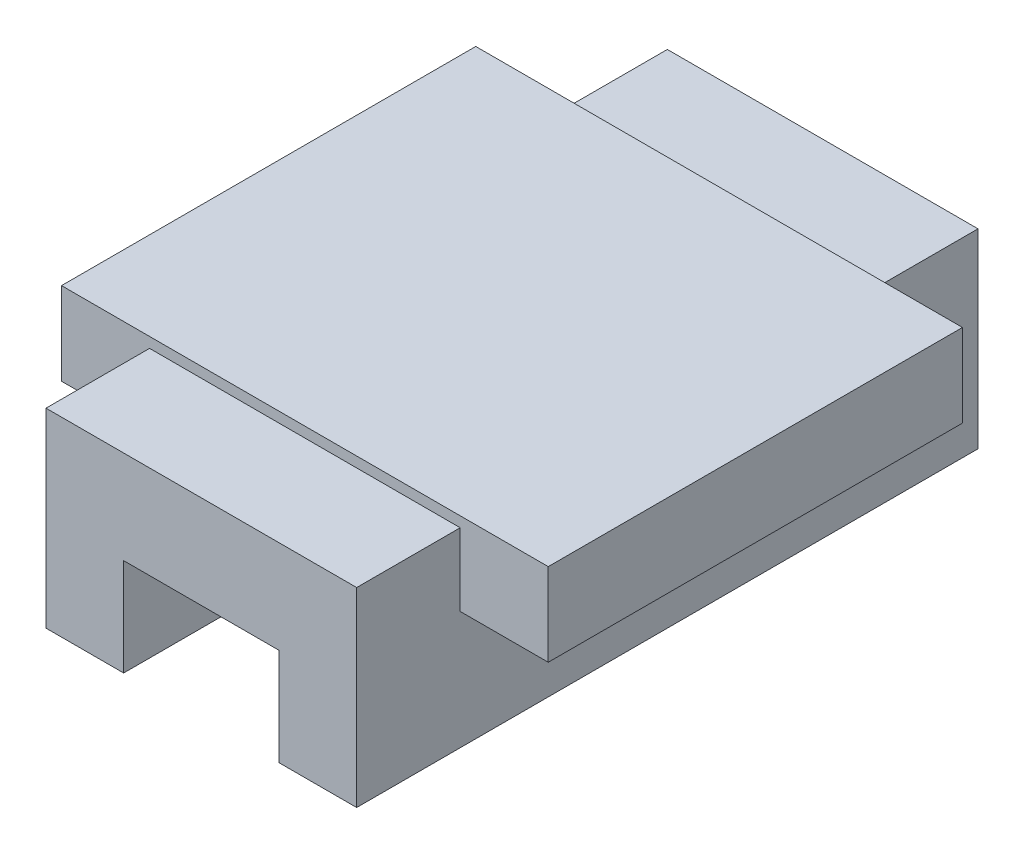
ISO-10303-21;
HEADER;
FILE_DESCRIPTION(('STEP AP214'),'2;1');
FILE_NAME('part.step','',(''),(''),'','','');
FILE_SCHEMA(('AUTOMOTIVE_DESIGN { 1 0 10303 214 1 1 1 1 }'));
ENDSEC;
DATA;
#1=APPLICATION_CONTEXT('core data for automotive mechanical design processes');
#2=APPLICATION_PROTOCOL_DEFINITION('international standard','automotive_design',2000,#1);
#3=PRODUCT_CONTEXT('',#1,'mechanical');
#4=PRODUCT('Part','Part','',(#3));
#5=PRODUCT_RELATED_PRODUCT_CATEGORY('part','',(#4));
#6=PRODUCT_DEFINITION_FORMATION('','',#4);
#7=PRODUCT_DEFINITION_CONTEXT('part definition',#1,'design');
#8=PRODUCT_DEFINITION('design','',#6,#7);
#9=PRODUCT_DEFINITION_SHAPE('','',#8);
#10=(LENGTH_UNIT() NAMED_UNIT(*) SI_UNIT(.MILLI.,.METRE.));
#11=(NAMED_UNIT(*) PLANE_ANGLE_UNIT() SI_UNIT($,.RADIAN.));
#12=(NAMED_UNIT(*) SI_UNIT($,.STERADIAN.) SOLID_ANGLE_UNIT());
#13=UNCERTAINTY_MEASURE_WITH_UNIT(LENGTH_MEASURE(1.E-05),#10,'distance_accuracy_value','');
#14=(GEOMETRIC_REPRESENTATION_CONTEXT(3) GLOBAL_UNCERTAINTY_ASSIGNED_CONTEXT((#13)) GLOBAL_UNIT_ASSIGNED_CONTEXT((#10,
#11,#12)) REPRESENTATION_CONTEXT('',''));
#15=CARTESIAN_POINT('',(0.,0.,0.));
#16=DIRECTION('',(0.,0.,1.));
#17=DIRECTION('',(1.,0.,0.));
#18=AXIS2_PLACEMENT_3D('',#15,#16,#17);
#19=CARTESIAN_POINT('',(0.,16.,30.));
#20=DIRECTION('',(0.,-1.,0.));
#21=DIRECTION('',(1.,0.,0.));
#22=AXIS2_PLACEMENT_3D('',#19,#20,#21);
#23=PLANE('',#22);
#24=DIRECTION('',(-1.,0.,0.));
#25=VECTOR('',#24,1.);
#26=CARTESIAN_POINT('',(0.,16.,-20.));
#27=LINE('',#26,#25);
#28=CARTESIAN_POINT('',(15.,16.,-20.));
#29=VERTEX_POINT('',#28);
#30=CARTESIAN_POINT('',(-15.,16.,-20.));
#31=VERTEX_POINT('',#30);
#32=EDGE_CURVE('E52',#29,#31,#27,.T.);
#33=ORIENTED_EDGE('',*,*,#32,.F.);
#34=DIRECTION('',(0.,0.,-1.));
#35=VECTOR('',#34,1.);
#36=CARTESIAN_POINT('',(15.,16.,30.));
#37=LINE('',#36,#35);
#38=CARTESIAN_POINT('',(15.,16.,-30.));
#39=VERTEX_POINT('',#38);
#40=EDGE_CURVE('E45',#29,#39,#37,.T.);
#41=ORIENTED_EDGE('',*,*,#40,.T.);
#42=DIRECTION('',(-1.,0.,0.));
#43=VECTOR('',#42,1.);
#44=CARTESIAN_POINT('',(0.,16.,-30.));
#45=LINE('',#44,#43);
#46=CARTESIAN_POINT('',(-15.,16.,-30.));
#47=VERTEX_POINT('',#46);
#48=EDGE_CURVE('E151',#39,#47,#45,.T.);
#49=ORIENTED_EDGE('',*,*,#48,.T.);
#50=DIRECTION('',(0.,0.,-1.));
#51=VECTOR('',#50,1.);
#52=CARTESIAN_POINT('',(-15.,16.,30.));
#53=LINE('',#52,#51);
#54=EDGE_CURVE('E174',#31,#47,#53,.T.);
#55=ORIENTED_EDGE('',*,*,#54,.F.);
#56=EDGE_LOOP('',(#33,#41,#49,#55));
#57=FACE_BOUND('',#56,.T.);
#58=ADVANCED_FACE('F37',(#57),#23,.F.);
#59=CARTESIAN_POINT('',(15.,0.,30.));
#60=DIRECTION('',(-1.,0.,0.));
#61=DIRECTION('',(0.,0.,1.));
#62=AXIS2_PLACEMENT_3D('',#59,#60,#61);
#63=PLANE('',#62);
#64=DIRECTION('',(0.,0.,-1.));
#65=VECTOR('',#64,1.);
#66=CARTESIAN_POINT('',(15.,9.,20.));
#67=LINE('',#66,#65);
#68=CARTESIAN_POINT('',(15.,9.,20.));
#69=VERTEX_POINT('',#68);
#70=CARTESIAN_POINT('',(15.,9.,-20.));
#71=VERTEX_POINT('',#70);
#72=EDGE_CURVE('E207',#69,#71,#67,.T.);
#73=ORIENTED_EDGE('',*,*,#72,.F.);
#74=DIRECTION('',(0.,1.,0.));
#75=VECTOR('',#74,1.);
#76=CARTESIAN_POINT('',(15.,0.,20.));
#77=LINE('',#76,#75);
#78=CARTESIAN_POINT('',(15.,16.,20.));
#79=VERTEX_POINT('',#78);
#80=EDGE_CURVE('E244',#69,#79,#77,.T.);
#81=ORIENTED_EDGE('',*,*,#80,.T.);
#82=CARTESIAN_POINT('',(15.,16.,30.));
#83=VERTEX_POINT('',#82);
#84=EDGE_CURVE('E11',#83,#79,#37,.T.);
#85=ORIENTED_EDGE('',*,*,#84,.F.);
#86=DIRECTION('',(0.,1.,0.));
#87=VECTOR('',#86,1.);
#88=CARTESIAN_POINT('',(15.,0.,30.));
#89=LINE('',#88,#87);
#90=CARTESIAN_POINT('',(15.,-2.4,30.));
#91=VERTEX_POINT('',#90);
#92=EDGE_CURVE('E199',#91,#83,#89,.T.);
#93=ORIENTED_EDGE('',*,*,#92,.F.);
#94=DIRECTION('',(0.,0.,-1.));
#95=VECTOR('',#94,1.);
#96=CARTESIAN_POINT('',(15.,-2.4,30.));
#97=LINE('',#96,#95);
#98=CARTESIAN_POINT('',(15.,-2.4,-30.));
#99=VERTEX_POINT('',#98);
#100=EDGE_CURVE('E61',#91,#99,#97,.T.);
#101=ORIENTED_EDGE('',*,*,#100,.T.);
#102=DIRECTION('',(0.,1.,0.));
#103=VECTOR('',#102,1.);
#104=CARTESIAN_POINT('',(15.,0.,-30.));
#105=LINE('',#104,#103);
#106=EDGE_CURVE('E149',#99,#39,#105,.T.);
#107=ORIENTED_EDGE('',*,*,#106,.T.);
#108=ORIENTED_EDGE('',*,*,#40,.F.);
#109=DIRECTION('',(0.,1.,0.));
#110=VECTOR('',#109,1.);
#111=CARTESIAN_POINT('',(15.,0.,-20.));
#112=LINE('',#111,#110);
#113=EDGE_CURVE('E228',#71,#29,#112,.T.);
#114=ORIENTED_EDGE('',*,*,#113,.F.);
#115=EDGE_LOOP('',(#73,#81,#85,#93,#101,#107,#108,#114));
#116=FACE_BOUND('',#115,.T.);
#117=ADVANCED_FACE('F39',(#116),#63,.F.);
#118=ORIENTED_EDGE('',*,*,#84,.T.);
#119=DIRECTION('',(-1.,0.,0.));
#120=VECTOR('',#119,1.);
#121=CARTESIAN_POINT('',(0.,16.,20.));
#122=LINE('',#121,#120);
#123=CARTESIAN_POINT('',(-15.,16.,20.));
#124=VERTEX_POINT('',#123);
#125=EDGE_CURVE('E247',#79,#124,#122,.T.);
#126=ORIENTED_EDGE('',*,*,#125,.T.);
#127=CARTESIAN_POINT('',(-15.,16.,30.));
#128=VERTEX_POINT('',#127);
#129=EDGE_CURVE('E175',#128,#124,#53,.T.);
#130=ORIENTED_EDGE('',*,*,#129,.F.);
#131=DIRECTION('',(-1.,0.,0.));
#132=VECTOR('',#131,1.);
#133=CARTESIAN_POINT('',(0.,16.,30.));
#134=LINE('',#133,#132);
#135=EDGE_CURVE('E100',#83,#128,#134,.T.);
#136=ORIENTED_EDGE('',*,*,#135,.F.);
#137=EDGE_LOOP('',(#118,#126,#130,#136));
#138=FACE_BOUND('',#137,.T.);
#139=ADVANCED_FACE('F308',(#138),#23,.F.);
#140=CARTESIAN_POINT('',(-15.,0.,30.));
#141=DIRECTION('',(-1.,0.,0.));
#142=DIRECTION('',(0.,-1.,0.));
#143=AXIS2_PLACEMENT_3D('',#140,#141,#142);
#144=PLANE('',#143);
#145=DIRECTION('',(0.,1.,0.));
#146=VECTOR('',#145,1.);
#147=CARTESIAN_POINT('',(-15.,0.,20.));
#148=LINE('',#147,#146);
#149=CARTESIAN_POINT('',(-15.,9.,20.));
#150=VERTEX_POINT('',#149);
#151=EDGE_CURVE('E250',#150,#124,#148,.T.);
#152=ORIENTED_EDGE('',*,*,#151,.F.);
#153=DIRECTION('',(0.,0.,-1.));
#154=VECTOR('',#153,1.);
#155=CARTESIAN_POINT('',(-15.,9.,20.));
#156=LINE('',#155,#154);
#157=CARTESIAN_POINT('',(-15.,9.,-20.));
#158=VERTEX_POINT('',#157);
#159=EDGE_CURVE('E205',#150,#158,#156,.T.);
#160=ORIENTED_EDGE('',*,*,#159,.T.);
#161=DIRECTION('',(0.,1.,0.));
#162=VECTOR('',#161,1.);
#163=CARTESIAN_POINT('',(-15.,0.,-20.));
#164=LINE('',#163,#162);
#165=EDGE_CURVE('E185',#158,#31,#164,.T.);
#166=ORIENTED_EDGE('',*,*,#165,.T.);
#167=ORIENTED_EDGE('',*,*,#54,.T.);
#168=DIRECTION('',(0.,1.,0.));
#169=VECTOR('',#168,1.);
#170=CARTESIAN_POINT('',(-15.,0.,-30.));
#171=LINE('',#170,#169);
#172=CARTESIAN_POINT('',(-15.,-2.4,-30.));
#173=VERTEX_POINT('',#172);
#174=EDGE_CURVE('E155',#173,#47,#171,.T.);
#175=ORIENTED_EDGE('',*,*,#174,.F.);
#176=DIRECTION('',(0.,0.,-1.));
#177=VECTOR('',#176,1.);
#178=CARTESIAN_POINT('',(-15.,-2.4,30.));
#179=LINE('',#178,#177);
#180=CARTESIAN_POINT('',(-15.,-2.4,30.));
#181=VERTEX_POINT('',#180);
#182=EDGE_CURVE('E173',#181,#173,#179,.T.);
#183=ORIENTED_EDGE('',*,*,#182,.F.);
#184=DIRECTION('',(0.,1.,0.));
#185=VECTOR('',#184,1.);
#186=CARTESIAN_POINT('',(-15.,0.,30.));
#187=LINE('',#186,#185);
#188=EDGE_CURVE('E197',#181,#128,#187,.T.);
#189=ORIENTED_EDGE('',*,*,#188,.T.);
#190=ORIENTED_EDGE('',*,*,#129,.T.);
#191=EDGE_LOOP('',(#152,#160,#166,#167,#175,#183,#189,#190));
#192=FACE_BOUND('',#191,.T.);
#193=ADVANCED_FACE('F183',(#192),#144,.T.);
#194=CARTESIAN_POINT('',(0.,-2.4,30.));
#195=DIRECTION('',(0.,-1.,0.));
#196=DIRECTION('',(1.,0.,0.));
#197=AXIS2_PLACEMENT_3D('',#194,#195,#196);
#198=PLANE('',#197);
#199=DIRECTION('',(-1.,0.,0.));
#200=VECTOR('',#199,1.);
#201=CARTESIAN_POINT('',(0.,-2.4,-30.));
#202=LINE('',#201,#200);
#203=CARTESIAN_POINT('',(-7.5,-2.4,-30.));
#204=VERTEX_POINT('',#203);
#205=EDGE_CURVE('E158',#204,#173,#202,.T.);
#206=ORIENTED_EDGE('',*,*,#205,.F.);
#207=DIRECTION('',(0.,0.,-1.));
#208=VECTOR('',#207,1.);
#209=CARTESIAN_POINT('',(-7.5,-2.4,30.));
#210=LINE('',#209,#208);
#211=CARTESIAN_POINT('',(-7.5,-2.4,30.));
#212=VERTEX_POINT('',#211);
#213=EDGE_CURVE('E171',#212,#204,#210,.T.);
#214=ORIENTED_EDGE('',*,*,#213,.F.);
#215=DIRECTION('',(-1.,0.,0.));
#216=VECTOR('',#215,1.);
#217=CARTESIAN_POINT('',(0.,-2.4,30.));
#218=LINE('',#217,#216);
#219=EDGE_CURVE('E146',#212,#181,#218,.T.);
#220=ORIENTED_EDGE('',*,*,#219,.T.);
#221=ORIENTED_EDGE('',*,*,#182,.T.);
#222=EDGE_LOOP('',(#206,#214,#220,#221));
#223=FACE_BOUND('',#222,.T.);
#224=ADVANCED_FACE('F194',(#223),#198,.T.);
#225=CARTESIAN_POINT('',(-7.5,0.,30.));
#226=DIRECTION('',(-1.,0.,0.));
#227=DIRECTION('',(0.,0.,1.));
#228=AXIS2_PLACEMENT_3D('',#225,#226,#227);
#229=PLANE('',#228);
#230=DIRECTION('',(0.,1.,0.));
#231=VECTOR('',#230,1.);
#232=CARTESIAN_POINT('',(-7.5,0.,-30.));
#233=LINE('',#232,#231);
#234=CARTESIAN_POINT('',(-7.5,7.,-30.));
#235=VERTEX_POINT('',#234);
#236=EDGE_CURVE('E161',#204,#235,#233,.T.);
#237=ORIENTED_EDGE('',*,*,#236,.T.);
#238=DIRECTION('',(0.,0.,-1.));
#239=VECTOR('',#238,1.);
#240=CARTESIAN_POINT('',(-7.5,7.,30.));
#241=LINE('',#240,#239);
#242=CARTESIAN_POINT('',(-7.5,7.,30.));
#243=VERTEX_POINT('',#242);
#244=EDGE_CURVE('E129',#243,#235,#241,.T.);
#245=ORIENTED_EDGE('',*,*,#244,.F.);
#246=DIRECTION('',(0.,1.,0.));
#247=VECTOR('',#246,1.);
#248=CARTESIAN_POINT('',(-7.5,0.,30.));
#249=LINE('',#248,#247);
#250=EDGE_CURVE('E139',#212,#243,#249,.T.);
#251=ORIENTED_EDGE('',*,*,#250,.F.);
#252=ORIENTED_EDGE('',*,*,#213,.T.);
#253=EDGE_LOOP('',(#237,#245,#251,#252));
#254=FACE_BOUND('',#253,.T.);
#255=ADVANCED_FACE('F346',(#254),#229,.F.);
#256=CARTESIAN_POINT('',(0.,7.,30.));
#257=DIRECTION('',(0.,-1.,0.));
#258=DIRECTION('',(1.,0.,0.));
#259=AXIS2_PLACEMENT_3D('',#256,#257,#258);
#260=PLANE('',#259);
#261=DIRECTION('',(-1.,0.,0.));
#262=VECTOR('',#261,1.);
#263=CARTESIAN_POINT('',(0.,7.,-30.));
#264=LINE('',#263,#262);
#265=CARTESIAN_POINT('',(7.5,7.,-30.));
#266=VERTEX_POINT('',#265);
#267=EDGE_CURVE('E124',#266,#235,#264,.T.);
#268=ORIENTED_EDGE('',*,*,#267,.F.);
#269=DIRECTION('',(0.,0.,-1.));
#270=VECTOR('',#269,1.);
#271=CARTESIAN_POINT('',(7.5,7.,30.));
#272=LINE('',#271,#270);
#273=CARTESIAN_POINT('',(7.5,7.,30.));
#274=VERTEX_POINT('',#273);
#275=EDGE_CURVE('E119',#274,#266,#272,.T.);
#276=ORIENTED_EDGE('',*,*,#275,.F.);
#277=DIRECTION('',(-1.,0.,0.));
#278=VECTOR('',#277,1.);
#279=CARTESIAN_POINT('',(0.,7.,30.));
#280=LINE('',#279,#278);
#281=EDGE_CURVE('E122',#274,#243,#280,.T.);
#282=ORIENTED_EDGE('',*,*,#281,.T.);
#283=ORIENTED_EDGE('',*,*,#244,.T.);
#284=EDGE_LOOP('',(#268,#276,#282,#283));
#285=FACE_BOUND('',#284,.T.);
#286=ADVANCED_FACE('F121',(#285),#260,.T.);
#287=CARTESIAN_POINT('',(7.5,0.,30.));
#288=DIRECTION('',(-1.,0.,0.));
#289=DIRECTION('',(0.,0.,1.));
#290=AXIS2_PLACEMENT_3D('',#287,#288,#289);
#291=PLANE('',#290);
#292=DIRECTION('',(0.,1.,0.));
#293=VECTOR('',#292,1.);
#294=CARTESIAN_POINT('',(7.5,0.,-30.));
#295=LINE('',#294,#293);
#296=CARTESIAN_POINT('',(7.5,-2.4,-30.));
#297=VERTEX_POINT('',#296);
#298=EDGE_CURVE('E166',#297,#266,#295,.T.);
#299=ORIENTED_EDGE('',*,*,#298,.F.);
#300=DIRECTION('',(0.,0.,-1.));
#301=VECTOR('',#300,1.);
#302=CARTESIAN_POINT('',(7.5,-2.4,30.));
#303=LINE('',#302,#301);
#304=CARTESIAN_POINT('',(7.5,-2.4,30.));
#305=VERTEX_POINT('',#304);
#306=EDGE_CURVE('E130',#305,#297,#303,.T.);
#307=ORIENTED_EDGE('',*,*,#306,.F.);
#308=DIRECTION('',(0.,1.,0.));
#309=VECTOR('',#308,1.);
#310=CARTESIAN_POINT('',(7.5,0.,30.));
#311=LINE('',#310,#309);
#312=EDGE_CURVE('E136',#305,#274,#311,.T.);
#313=ORIENTED_EDGE('',*,*,#312,.T.);
#314=ORIENTED_EDGE('',*,*,#275,.T.);
#315=EDGE_LOOP('',(#299,#307,#313,#314));
#316=FACE_BOUND('',#315,.T.);
#317=ADVANCED_FACE('F142',(#316),#291,.T.);
#318=EDGE_CURVE('E162',#99,#297,#202,.T.);
#319=ORIENTED_EDGE('',*,*,#318,.F.);
#320=ORIENTED_EDGE('',*,*,#100,.F.);
#321=EDGE_CURVE('E143',#91,#305,#218,.T.);
#322=ORIENTED_EDGE('',*,*,#321,.T.);
#323=ORIENTED_EDGE('',*,*,#306,.T.);
#324=EDGE_LOOP('',(#319,#320,#322,#323));
#325=FACE_BOUND('',#324,.T.);
#326=ADVANCED_FACE('F335',(#325),#198,.T.);
#327=CARTESIAN_POINT('',(0.,0.,30.));
#328=DIRECTION('',(0.,0.,1.));
#329=DIRECTION('',(1.,0.,0.));
#330=AXIS2_PLACEMENT_3D('',#327,#328,#329);
#331=PLANE('',#330);
#332=ORIENTED_EDGE('',*,*,#92,.T.);
#333=ORIENTED_EDGE('',*,*,#135,.T.);
#334=ORIENTED_EDGE('',*,*,#188,.F.);
#335=ORIENTED_EDGE('',*,*,#219,.F.);
#336=ORIENTED_EDGE('',*,*,#250,.T.);
#337=ORIENTED_EDGE('',*,*,#281,.F.);
#338=ORIENTED_EDGE('',*,*,#312,.F.);
#339=ORIENTED_EDGE('',*,*,#321,.F.);
#340=EDGE_LOOP('',(#332,#333,#334,#335,#336,#337,#338,#339));
#341=FACE_BOUND('',#340,.T.);
#342=ADVANCED_FACE('F134',(#341),#331,.T.);
#343=CARTESIAN_POINT('',(0.,0.,-30.));
#344=DIRECTION('',(0.,0.,1.));
#345=DIRECTION('',(1.,0.,0.));
#346=AXIS2_PLACEMENT_3D('',#343,#344,#345);
#347=PLANE('',#346);
#348=ORIENTED_EDGE('',*,*,#106,.F.);
#349=ORIENTED_EDGE('',*,*,#318,.T.);
#350=ORIENTED_EDGE('',*,*,#298,.T.);
#351=ORIENTED_EDGE('',*,*,#267,.T.);
#352=ORIENTED_EDGE('',*,*,#236,.F.);
#353=ORIENTED_EDGE('',*,*,#205,.T.);
#354=ORIENTED_EDGE('',*,*,#174,.T.);
#355=ORIENTED_EDGE('',*,*,#48,.F.);
#356=EDGE_LOOP('',(#348,#349,#350,#351,#352,#353,#354,#355));
#357=FACE_BOUND('',#356,.T.);
#358=ADVANCED_FACE('F190',(#357),#347,.F.);
#359=CARTESIAN_POINT('',(-23.5,0.,20.));
#360=DIRECTION('',(-1.,0.,0.));
#361=DIRECTION('',(0.,0.,1.));
#362=AXIS2_PLACEMENT_3D('',#359,#360,#361);
#363=PLANE('',#362);
#364=DIRECTION('',(0.,1.,0.));
#365=VECTOR('',#364,1.);
#366=CARTESIAN_POINT('',(-23.5,0.,-20.));
#367=LINE('',#366,#365);
#368=CARTESIAN_POINT('',(-23.5,9.,-20.));
#369=VERTEX_POINT('',#368);
#370=CARTESIAN_POINT('',(-23.5,17.,-20.));
#371=VERTEX_POINT('',#370);
#372=EDGE_CURVE('E235',#369,#371,#367,.T.);
#373=ORIENTED_EDGE('',*,*,#372,.F.);
#374=DIRECTION('',(0.,0.,-1.));
#375=VECTOR('',#374,1.);
#376=CARTESIAN_POINT('',(-23.5,9.,20.));
#377=LINE('',#376,#375);
#378=CARTESIAN_POINT('',(-23.5,9.,20.));
#379=VERTEX_POINT('',#378);
#380=EDGE_CURVE('E152',#379,#369,#377,.T.);
#381=ORIENTED_EDGE('',*,*,#380,.F.);
#382=DIRECTION('',(0.,1.,0.));
#383=VECTOR('',#382,1.);
#384=CARTESIAN_POINT('',(-23.5,0.,20.));
#385=LINE('',#384,#383);
#386=CARTESIAN_POINT('',(-23.5,17.,20.));
#387=VERTEX_POINT('',#386);
#388=EDGE_CURVE('E223',#379,#387,#385,.T.);
#389=ORIENTED_EDGE('',*,*,#388,.T.);
#390=DIRECTION('',(0.,0.,-1.));
#391=VECTOR('',#390,1.);
#392=CARTESIAN_POINT('',(-23.5,17.,20.));
#393=LINE('',#392,#391);
#394=EDGE_CURVE('E216',#387,#371,#393,.T.);
#395=ORIENTED_EDGE('',*,*,#394,.T.);
#396=EDGE_LOOP('',(#373,#381,#389,#395));
#397=FACE_BOUND('',#396,.T.);
#398=ADVANCED_FACE('F261',(#397),#363,.T.);
#399=CARTESIAN_POINT('',(0.,9.,20.));
#400=DIRECTION('',(0.,-1.,0.));
#401=DIRECTION('',(1.,0.,0.));
#402=AXIS2_PLACEMENT_3D('',#399,#400,#401);
#403=PLANE('',#402);
#404=DIRECTION('',(-1.,0.,0.));
#405=VECTOR('',#404,1.);
#406=CARTESIAN_POINT('',(0.,9.,-20.));
#407=LINE('',#406,#405);
#408=EDGE_CURVE('E232',#158,#369,#407,.T.);
#409=ORIENTED_EDGE('',*,*,#408,.F.);
#410=ORIENTED_EDGE('',*,*,#159,.F.);
#411=DIRECTION('',(-1.,0.,0.));
#412=VECTOR('',#411,1.);
#413=CARTESIAN_POINT('',(0.,9.,20.));
#414=LINE('',#413,#412);
#415=EDGE_CURVE('E253',#150,#379,#414,.T.);
#416=ORIENTED_EDGE('',*,*,#415,.T.);
#417=ORIENTED_EDGE('',*,*,#380,.T.);
#418=EDGE_LOOP('',(#409,#410,#416,#417));
#419=FACE_BOUND('',#418,.T.);
#420=ADVANCED_FACE('F275',(#419),#403,.T.);
#421=CARTESIAN_POINT('',(23.5,9.,-20.));
#422=VERTEX_POINT('',#421);
#423=EDGE_CURVE('E227',#422,#71,#407,.T.);
#424=ORIENTED_EDGE('',*,*,#423,.F.);
#425=DIRECTION('',(0.,0.,-1.));
#426=VECTOR('',#425,1.);
#427=CARTESIAN_POINT('',(23.5,9.,20.));
#428=LINE('',#427,#426);
#429=CARTESIAN_POINT('',(23.5,9.,20.));
#430=VERTEX_POINT('',#429);
#431=EDGE_CURVE('E210',#430,#422,#428,.T.);
#432=ORIENTED_EDGE('',*,*,#431,.F.);
#433=EDGE_CURVE('E243',#430,#69,#414,.T.);
#434=ORIENTED_EDGE('',*,*,#433,.T.);
#435=ORIENTED_EDGE('',*,*,#72,.T.);
#436=EDGE_LOOP('',(#424,#432,#434,#435));
#437=FACE_BOUND('',#436,.T.);
#438=ADVANCED_FACE('F330',(#437),#403,.T.);
#439=CARTESIAN_POINT('',(23.5,0.,20.));
#440=DIRECTION('',(-1.,0.,0.));
#441=DIRECTION('',(0.,0.,1.));
#442=AXIS2_PLACEMENT_3D('',#439,#440,#441);
#443=PLANE('',#442);
#444=DIRECTION('',(0.,1.,0.));
#445=VECTOR('',#444,1.);
#446=CARTESIAN_POINT('',(23.5,0.,-20.));
#447=LINE('',#446,#445);
#448=CARTESIAN_POINT('',(23.5,17.,-20.));
#449=VERTEX_POINT('',#448);
#450=EDGE_CURVE('E224',#422,#449,#447,.T.);
#451=ORIENTED_EDGE('',*,*,#450,.T.);
#452=DIRECTION('',(0.,0.,-1.));
#453=VECTOR('',#452,1.);
#454=CARTESIAN_POINT('',(23.5,17.,20.));
#455=LINE('',#454,#453);
#456=CARTESIAN_POINT('',(23.5,17.,20.));
#457=VERTEX_POINT('',#456);
#458=EDGE_CURVE('E213',#457,#449,#455,.T.);
#459=ORIENTED_EDGE('',*,*,#458,.F.);
#460=DIRECTION('',(0.,1.,0.));
#461=VECTOR('',#460,1.);
#462=CARTESIAN_POINT('',(23.5,0.,20.));
#463=LINE('',#462,#461);
#464=EDGE_CURVE('E240',#430,#457,#463,.T.);
#465=ORIENTED_EDGE('',*,*,#464,.F.);
#466=ORIENTED_EDGE('',*,*,#431,.T.);
#467=EDGE_LOOP('',(#451,#459,#465,#466));
#468=FACE_BOUND('',#467,.T.);
#469=ADVANCED_FACE('F291',(#468),#443,.F.);
#470=CARTESIAN_POINT('',(0.,17.,20.));
#471=DIRECTION('',(0.,-1.,0.));
#472=DIRECTION('',(1.,0.,0.));
#473=AXIS2_PLACEMENT_3D('',#470,#471,#472);
#474=PLANE('',#473);
#475=DIRECTION('',(-1.,0.,0.));
#476=VECTOR('',#475,1.);
#477=CARTESIAN_POINT('',(0.,17.,-20.));
#478=LINE('',#477,#476);
#479=EDGE_CURVE('E220',#449,#371,#478,.T.);
#480=ORIENTED_EDGE('',*,*,#479,.T.);
#481=ORIENTED_EDGE('',*,*,#394,.F.);
#482=DIRECTION('',(-1.,0.,0.));
#483=VECTOR('',#482,1.);
#484=CARTESIAN_POINT('',(0.,17.,20.));
#485=LINE('',#484,#483);
#486=EDGE_CURVE('E219',#457,#387,#485,.T.);
#487=ORIENTED_EDGE('',*,*,#486,.F.);
#488=ORIENTED_EDGE('',*,*,#458,.T.);
#489=EDGE_LOOP('',(#480,#481,#487,#488));
#490=FACE_BOUND('',#489,.T.);
#491=ADVANCED_FACE('F298',(#490),#474,.F.);
#492=CARTESIAN_POINT('',(0.,0.,20.));
#493=DIRECTION('',(0.,0.,1.));
#494=DIRECTION('',(1.,0.,0.));
#495=AXIS2_PLACEMENT_3D('',#492,#493,#494);
#496=PLANE('',#495);
#497=ORIENTED_EDGE('',*,*,#388,.F.);
#498=ORIENTED_EDGE('',*,*,#415,.F.);
#499=ORIENTED_EDGE('',*,*,#151,.T.);
#500=ORIENTED_EDGE('',*,*,#125,.F.);
#501=ORIENTED_EDGE('',*,*,#80,.F.);
#502=ORIENTED_EDGE('',*,*,#433,.F.);
#503=ORIENTED_EDGE('',*,*,#464,.T.);
#504=ORIENTED_EDGE('',*,*,#486,.T.);
#505=EDGE_LOOP('',(#497,#498,#499,#500,#501,#502,#503,#504));
#506=FACE_BOUND('',#505,.T.);
#507=ADVANCED_FACE('F268',(#506),#496,.T.);
#508=CARTESIAN_POINT('',(0.,0.,-20.));
#509=DIRECTION('',(0.,0.,1.));
#510=DIRECTION('',(1.,0.,0.));
#511=AXIS2_PLACEMENT_3D('',#508,#509,#510);
#512=PLANE('',#511);
#513=ORIENTED_EDGE('',*,*,#372,.T.);
#514=ORIENTED_EDGE('',*,*,#479,.F.);
#515=ORIENTED_EDGE('',*,*,#450,.F.);
#516=ORIENTED_EDGE('',*,*,#423,.T.);
#517=ORIENTED_EDGE('',*,*,#113,.T.);
#518=ORIENTED_EDGE('',*,*,#32,.T.);
#519=ORIENTED_EDGE('',*,*,#165,.F.);
#520=ORIENTED_EDGE('',*,*,#408,.T.);
#521=EDGE_LOOP('',(#513,#514,#515,#516,#517,#518,#519,#520));
#522=FACE_BOUND('',#521,.T.);
#523=ADVANCED_FACE('F299',(#522),#512,.F.);
#524=CLOSED_SHELL('',(#58,#117,#139,#193,#224,#255,#286,#317,#326,#342,#358,#398,#420,#438,#469,
#491,#507,#523));
#525=MANIFOLD_SOLID_BREP('B2',#524);
#526=ADVANCED_BREP_SHAPE_REPRESENTATION('',(#18,#525),#14);
#527=SHAPE_DEFINITION_REPRESENTATION(#9,#526);
ENDSEC;
END-ISO-10303-21;
